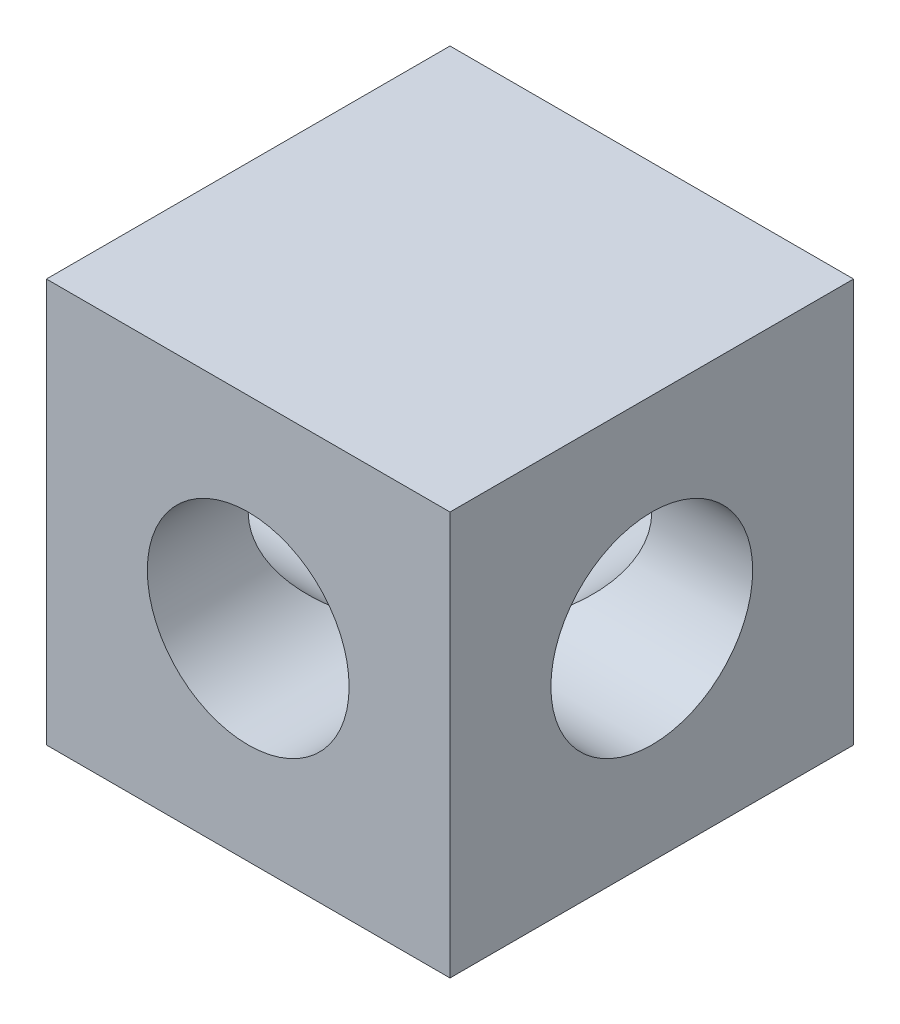
ISO-10303-21;
HEADER;
FILE_DESCRIPTION(('STEP AP214'),'2;1');
FILE_NAME('part.step','',(''),(''),'','','');
FILE_SCHEMA(('AUTOMOTIVE_DESIGN { 1 0 10303 214 1 1 1 1 }'));
ENDSEC;
DATA;
#1=APPLICATION_CONTEXT('core data for automotive mechanical design processes');
#2=APPLICATION_PROTOCOL_DEFINITION('international standard','automotive_design',2000,#1);
#3=PRODUCT_CONTEXT('',#1,'mechanical');
#4=PRODUCT('Part','Part','',(#3));
#5=PRODUCT_RELATED_PRODUCT_CATEGORY('part','',(#4));
#6=PRODUCT_DEFINITION_FORMATION('','',#4);
#7=PRODUCT_DEFINITION_CONTEXT('part definition',#1,'design');
#8=PRODUCT_DEFINITION('design','',#6,#7);
#9=PRODUCT_DEFINITION_SHAPE('','',#8);
#10=(LENGTH_UNIT() NAMED_UNIT(*) SI_UNIT(.MILLI.,.METRE.));
#11=(NAMED_UNIT(*) PLANE_ANGLE_UNIT() SI_UNIT($,.RADIAN.));
#12=(NAMED_UNIT(*) SI_UNIT($,.STERADIAN.) SOLID_ANGLE_UNIT());
#13=UNCERTAINTY_MEASURE_WITH_UNIT(LENGTH_MEASURE(1.E-05),#10,'distance_accuracy_value','');
#14=(GEOMETRIC_REPRESENTATION_CONTEXT(3) GLOBAL_UNCERTAINTY_ASSIGNED_CONTEXT((#13)) GLOBAL_UNIT_ASSIGNED_CONTEXT((#10,
#11,#12)) REPRESENTATION_CONTEXT('',''));
#15=CARTESIAN_POINT('',(0.,0.,0.));
#16=DIRECTION('',(0.,0.,1.));
#17=DIRECTION('',(1.,0.,0.));
#18=AXIS2_PLACEMENT_3D('',#15,#16,#17);
#19=CARTESIAN_POINT('',(0.,0.,9.525));
#20=DIRECTION('',(0.,0.,-1.));
#21=DIRECTION('',(-1.,0.,0.));
#22=AXIS2_PLACEMENT_3D('',#19,#20,#21);
#23=CYLINDRICAL_SURFACE('',#22,4.7625);
#24=CARTESIAN_POINT('',(0.,0.,0.));
#25=DIRECTION('',(0.707106781186548,0.,-0.707106781186547));
#26=DIRECTION('',(-0.707106781186548,0.,-0.707106781186547));
#27=AXIS2_PLACEMENT_3D('',#24,#25,#26);
#28=ELLIPSE('',#27,6.73519209080187,4.7625);
#29=CARTESIAN_POINT('',(0.,-4.7625,0.));
#30=VERTEX_POINT('',#29);
#31=CARTESIAN_POINT('',(0.,4.7625,0.));
#32=VERTEX_POINT('',#31);
#33=EDGE_CURVE('E11',#30,#32,#28,.F.);
#34=ORIENTED_EDGE('',*,*,#33,.F.);
#35=CARTESIAN_POINT('',(0.,0.,0.));
#36=DIRECTION('',(-0.707106781186548,0.,-0.707106781186547));
#37=DIRECTION('',(0.707106781186548,0.,-0.707106781186547));
#38=AXIS2_PLACEMENT_3D('',#35,#36,#37);
#39=ELLIPSE('',#38,6.73519209080187,4.7625);
#40=EDGE_CURVE('E53',#32,#30,#39,.F.);
#41=ORIENTED_EDGE('',*,*,#40,.F.);
#42=EDGE_LOOP('',(#34,#41));
#43=FACE_BOUND('',#42,.T.);
#44=CARTESIAN_POINT('',(0.,0.,9.525));
#45=DIRECTION('',(0.,0.,1.));
#46=DIRECTION('',(1.,0.,0.));
#47=AXIS2_PLACEMENT_3D('',#44,#45,#46);
#48=CIRCLE('',#47,4.7625);
#49=CARTESIAN_POINT('',(4.7625,0.,9.525));
#50=VERTEX_POINT('',#49);
#51=EDGE_CURVE('E130',#50,#50,#48,.T.);
#52=ORIENTED_EDGE('',*,*,#51,.T.);
#53=EDGE_LOOP('',(#52));
#54=FACE_BOUND('',#53,.T.);
#55=ADVANCED_FACE('F39',(#43,#54),#23,.F.);
#56=CARTESIAN_POINT('',(-9.525,-9.525,9.525));
#57=DIRECTION('',(0.,0.,-1.));
#58=DIRECTION('',(-1.,0.,0.));
#59=AXIS2_PLACEMENT_3D('',#56,#57,#58);
#60=PLANE('',#59);
#61=DIRECTION('',(0.,1.,0.));
#62=VECTOR('',#61,1.);
#63=CARTESIAN_POINT('',(-9.525,-9.525,9.525));
#64=LINE('',#63,#62);
#65=CARTESIAN_POINT('',(-9.525,-9.525,9.525));
#66=VERTEX_POINT('',#65);
#67=CARTESIAN_POINT('',(-9.525,9.525,9.525));
#68=VERTEX_POINT('',#67);
#69=EDGE_CURVE('E120',#66,#68,#64,.T.);
#70=ORIENTED_EDGE('',*,*,#69,.F.);
#71=DIRECTION('',(1.,0.,0.));
#72=VECTOR('',#71,1.);
#73=CARTESIAN_POINT('',(-9.525,-9.525,9.525));
#74=LINE('',#73,#72);
#75=CARTESIAN_POINT('',(9.525,-9.525,9.525));
#76=VERTEX_POINT('',#75);
#77=EDGE_CURVE('E113',#66,#76,#74,.T.);
#78=ORIENTED_EDGE('',*,*,#77,.T.);
#79=DIRECTION('',(0.,-1.,0.));
#80=VECTOR('',#79,1.);
#81=CARTESIAN_POINT('',(9.525,9.525,9.525));
#82=LINE('',#81,#80);
#83=CARTESIAN_POINT('',(9.525,9.525,9.525));
#84=VERTEX_POINT('',#83);
#85=EDGE_CURVE('E132',#84,#76,#82,.T.);
#86=ORIENTED_EDGE('',*,*,#85,.F.);
#87=DIRECTION('',(-1.,0.,0.));
#88=VECTOR('',#87,1.);
#89=CARTESIAN_POINT('',(9.525,9.525,9.525));
#90=LINE('',#89,#88);
#91=EDGE_CURVE('E89',#84,#68,#90,.T.);
#92=ORIENTED_EDGE('',*,*,#91,.T.);
#93=EDGE_LOOP('',(#70,#78,#86,#92));
#94=FACE_BOUND('',#93,.T.);
#95=ORIENTED_EDGE('',*,*,#51,.F.);
#96=EDGE_LOOP('',(#95));
#97=FACE_BOUND('',#96,.T.);
#98=ADVANCED_FACE('F159',(#94,#97),#60,.F.);
#99=CARTESIAN_POINT('',(-9.525,-9.525,-9.525));
#100=DIRECTION('',(0.,0.,-1.));
#101=DIRECTION('',(-1.,0.,0.));
#102=AXIS2_PLACEMENT_3D('',#99,#100,#101);
#103=PLANE('',#102);
#104=DIRECTION('',(0.,1.,0.));
#105=VECTOR('',#104,1.);
#106=CARTESIAN_POINT('',(-9.525,-9.525,-9.525));
#107=LINE('',#106,#105);
#108=CARTESIAN_POINT('',(-9.525,-9.525,-9.525));
#109=VERTEX_POINT('',#108);
#110=CARTESIAN_POINT('',(-9.525,9.525,-9.525));
#111=VERTEX_POINT('',#110);
#112=EDGE_CURVE('E127',#109,#111,#107,.T.);
#113=ORIENTED_EDGE('',*,*,#112,.T.);
#114=DIRECTION('',(-1.,0.,0.));
#115=VECTOR('',#114,1.);
#116=CARTESIAN_POINT('',(9.525,9.525,-9.525));
#117=LINE('',#116,#115);
#118=CARTESIAN_POINT('',(9.525,9.525,-9.525));
#119=VERTEX_POINT('',#118);
#120=EDGE_CURVE('E124',#119,#111,#117,.T.);
#121=ORIENTED_EDGE('',*,*,#120,.F.);
#122=DIRECTION('',(0.,-1.,0.));
#123=VECTOR('',#122,1.);
#124=CARTESIAN_POINT('',(9.525,9.525,-9.525));
#125=LINE('',#124,#123);
#126=CARTESIAN_POINT('',(9.525,-9.525,-9.525));
#127=VERTEX_POINT('',#126);
#128=EDGE_CURVE('E121',#119,#127,#125,.T.);
#129=ORIENTED_EDGE('',*,*,#128,.T.);
#130=DIRECTION('',(1.,0.,0.));
#131=VECTOR('',#130,1.);
#132=CARTESIAN_POINT('',(-9.525,-9.525,-9.525));
#133=LINE('',#132,#131);
#134=EDGE_CURVE('E118',#109,#127,#133,.T.);
#135=ORIENTED_EDGE('',*,*,#134,.F.);
#136=EDGE_LOOP('',(#113,#121,#129,#135));
#137=FACE_BOUND('',#136,.T.);
#138=CARTESIAN_POINT('',(0.,0.,-9.525));
#139=DIRECTION('',(0.,0.,1.));
#140=DIRECTION('',(1.,0.,0.));
#141=AXIS2_PLACEMENT_3D('',#138,#139,#140);
#142=CIRCLE('',#141,4.7625);
#143=CARTESIAN_POINT('',(4.7625,0.,-9.525));
#144=VERTEX_POINT('',#143);
#145=EDGE_CURVE('E138',#144,#144,#142,.T.);
#146=ORIENTED_EDGE('',*,*,#145,.T.);
#147=EDGE_LOOP('',(#146));
#148=FACE_BOUND('',#147,.T.);
#149=ADVANCED_FACE('F163',(#137,#148),#103,.T.);
#150=CARTESIAN_POINT('',(-9.525,-9.525,9.525));
#151=DIRECTION('',(-1.,0.,0.));
#152=DIRECTION('',(0.,-1.,0.));
#153=AXIS2_PLACEMENT_3D('',#150,#151,#152);
#154=PLANE('',#153);
#155=CARTESIAN_POINT('',(-9.525,0.,0.));
#156=DIRECTION('',(1.,0.,0.));
#157=DIRECTION('',(0.,0.,-1.));
#158=AXIS2_PLACEMENT_3D('',#155,#156,#157);
#159=CIRCLE('',#158,4.7625);
#160=CARTESIAN_POINT('',(-9.525,0.,-4.7625));
#161=VERTEX_POINT('',#160);
#162=EDGE_CURVE('E141',#161,#161,#159,.T.);
#163=ORIENTED_EDGE('',*,*,#162,.T.);
#164=EDGE_LOOP('',(#163));
#165=FACE_BOUND('',#164,.T.);
#166=ORIENTED_EDGE('',*,*,#112,.F.);
#167=DIRECTION('',(0.,0.,-1.));
#168=VECTOR('',#167,1.);
#169=CARTESIAN_POINT('',(-9.525,-9.525,9.525));
#170=LINE('',#169,#168);
#171=EDGE_CURVE('E62',#66,#109,#170,.T.);
#172=ORIENTED_EDGE('',*,*,#171,.F.);
#173=ORIENTED_EDGE('',*,*,#69,.T.);
#174=DIRECTION('',(0.,0.,-1.));
#175=VECTOR('',#174,1.);
#176=CARTESIAN_POINT('',(-9.525,9.525,9.525));
#177=LINE('',#176,#175);
#178=EDGE_CURVE('E110',#68,#111,#177,.T.);
#179=ORIENTED_EDGE('',*,*,#178,.T.);
#180=EDGE_LOOP('',(#166,#172,#173,#179));
#181=FACE_BOUND('',#180,.T.);
#182=ADVANCED_FACE('F41',(#165,#181),#154,.T.);
#183=CARTESIAN_POINT('',(-9.525,-9.525,9.525));
#184=DIRECTION('',(0.,1.,0.));
#185=DIRECTION('',(-1.,0.,0.));
#186=AXIS2_PLACEMENT_3D('',#183,#184,#185);
#187=PLANE('',#186);
#188=ORIENTED_EDGE('',*,*,#134,.T.);
#189=DIRECTION('',(0.,0.,-1.));
#190=VECTOR('',#189,1.);
#191=CARTESIAN_POINT('',(9.525,-9.525,9.525));
#192=LINE('',#191,#190);
#193=EDGE_CURVE('E115',#76,#127,#192,.T.);
#194=ORIENTED_EDGE('',*,*,#193,.F.);
#195=ORIENTED_EDGE('',*,*,#77,.F.);
#196=ORIENTED_EDGE('',*,*,#171,.T.);
#197=EDGE_LOOP('',(#188,#194,#195,#196));
#198=FACE_BOUND('',#197,.T.);
#199=ADVANCED_FACE('F169',(#198),#187,.F.);
#200=CARTESIAN_POINT('',(9.525,9.525,9.525));
#201=DIRECTION('',(1.,0.,0.));
#202=DIRECTION('',(0.,1.,0.));
#203=AXIS2_PLACEMENT_3D('',#200,#201,#202);
#204=PLANE('',#203);
#205=CARTESIAN_POINT('',(9.525,0.,0.));
#206=DIRECTION('',(1.,0.,0.));
#207=DIRECTION('',(0.,0.,-1.));
#208=AXIS2_PLACEMENT_3D('',#205,#206,#207);
#209=CIRCLE('',#208,4.7625);
#210=CARTESIAN_POINT('',(9.525,0.,-4.7625));
#211=VERTEX_POINT('',#210);
#212=EDGE_CURVE('E144',#211,#211,#209,.T.);
#213=ORIENTED_EDGE('',*,*,#212,.F.);
#214=EDGE_LOOP('',(#213));
#215=FACE_BOUND('',#214,.T.);
#216=ORIENTED_EDGE('',*,*,#128,.F.);
#217=DIRECTION('',(0.,0.,-1.));
#218=VECTOR('',#217,1.);
#219=CARTESIAN_POINT('',(9.525,9.525,9.525));
#220=LINE('',#219,#218);
#221=EDGE_CURVE('E112',#84,#119,#220,.T.);
#222=ORIENTED_EDGE('',*,*,#221,.F.);
#223=ORIENTED_EDGE('',*,*,#85,.T.);
#224=ORIENTED_EDGE('',*,*,#193,.T.);
#225=EDGE_LOOP('',(#216,#222,#223,#224));
#226=FACE_BOUND('',#225,.T.);
#227=ADVANCED_FACE('F172',(#215,#226),#204,.T.);
#228=CARTESIAN_POINT('',(9.525,9.525,9.525));
#229=DIRECTION('',(0.,-1.,0.));
#230=DIRECTION('',(1.,0.,0.));
#231=AXIS2_PLACEMENT_3D('',#228,#229,#230);
#232=PLANE('',#231);
#233=ORIENTED_EDGE('',*,*,#120,.T.);
#234=ORIENTED_EDGE('',*,*,#178,.F.);
#235=ORIENTED_EDGE('',*,*,#91,.F.);
#236=ORIENTED_EDGE('',*,*,#221,.T.);
#237=EDGE_LOOP('',(#233,#234,#235,#236));
#238=FACE_BOUND('',#237,.T.);
#239=ADVANCED_FACE('F156',(#238),#232,.F.);
#240=CARTESIAN_POINT('',(0.,0.,0.));
#241=DIRECTION('',(0.707106781186548,0.,-0.707106781186547));
#242=DIRECTION('',(-0.707106781186548,0.,-0.707106781186547));
#243=AXIS2_PLACEMENT_3D('',#240,#241,#242);
#244=ELLIPSE('',#243,6.73519209080187,4.7625);
#245=EDGE_CURVE('E47',#30,#32,#244,.T.);
#246=ORIENTED_EDGE('',*,*,#245,.F.);
#247=CARTESIAN_POINT('',(0.,0.,0.));
#248=DIRECTION('',(-0.707106781186548,0.,-0.707106781186547));
#249=DIRECTION('',(0.707106781186548,0.,-0.707106781186547));
#250=AXIS2_PLACEMENT_3D('',#247,#248,#249);
#251=ELLIPSE('',#250,6.73519209080187,4.7625);
#252=EDGE_CURVE('E96',#32,#30,#251,.T.);
#253=ORIENTED_EDGE('',*,*,#252,.F.);
#254=EDGE_LOOP('',(#246,#253));
#255=FACE_BOUND('',#254,.T.);
#256=ORIENTED_EDGE('',*,*,#145,.F.);
#257=EDGE_LOOP('',(#256));
#258=FACE_BOUND('',#257,.T.);
#259=ADVANCED_FACE('F107',(#255,#258),#23,.F.);
#260=CARTESIAN_POINT('',(-9.525,0.,0.));
#261=DIRECTION('',(1.,0.,0.));
#262=DIRECTION('',(0.,0.,-1.));
#263=AXIS2_PLACEMENT_3D('',#260,#261,#262);
#264=CYLINDRICAL_SURFACE('',#263,4.7625);
#265=ORIENTED_EDGE('',*,*,#245,.T.);
#266=ORIENTED_EDGE('',*,*,#40,.T.);
#267=EDGE_LOOP('',(#265,#266));
#268=FACE_BOUND('',#267,.T.);
#269=ORIENTED_EDGE('',*,*,#162,.F.);
#270=EDGE_LOOP('',(#269));
#271=FACE_BOUND('',#270,.T.);
#272=ADVANCED_FACE('F103',(#268,#271),#264,.F.);
#273=ORIENTED_EDGE('',*,*,#33,.T.);
#274=ORIENTED_EDGE('',*,*,#252,.T.);
#275=EDGE_LOOP('',(#273,#274));
#276=FACE_BOUND('',#275,.T.);
#277=ORIENTED_EDGE('',*,*,#212,.T.);
#278=EDGE_LOOP('',(#277));
#279=FACE_BOUND('',#278,.T.);
#280=ADVANCED_FACE('F97',(#276,#279),#264,.F.);
#281=CLOSED_SHELL('',(#55,#98,#149,#182,#199,#227,#239,#259,#272,#280));
#282=MANIFOLD_SOLID_BREP('B2',#281);
#283=ADVANCED_BREP_SHAPE_REPRESENTATION('',(#18,#282),#14);
#284=SHAPE_DEFINITION_REPRESENTATION(#9,#283);
ENDSEC;
END-ISO-10303-21;
